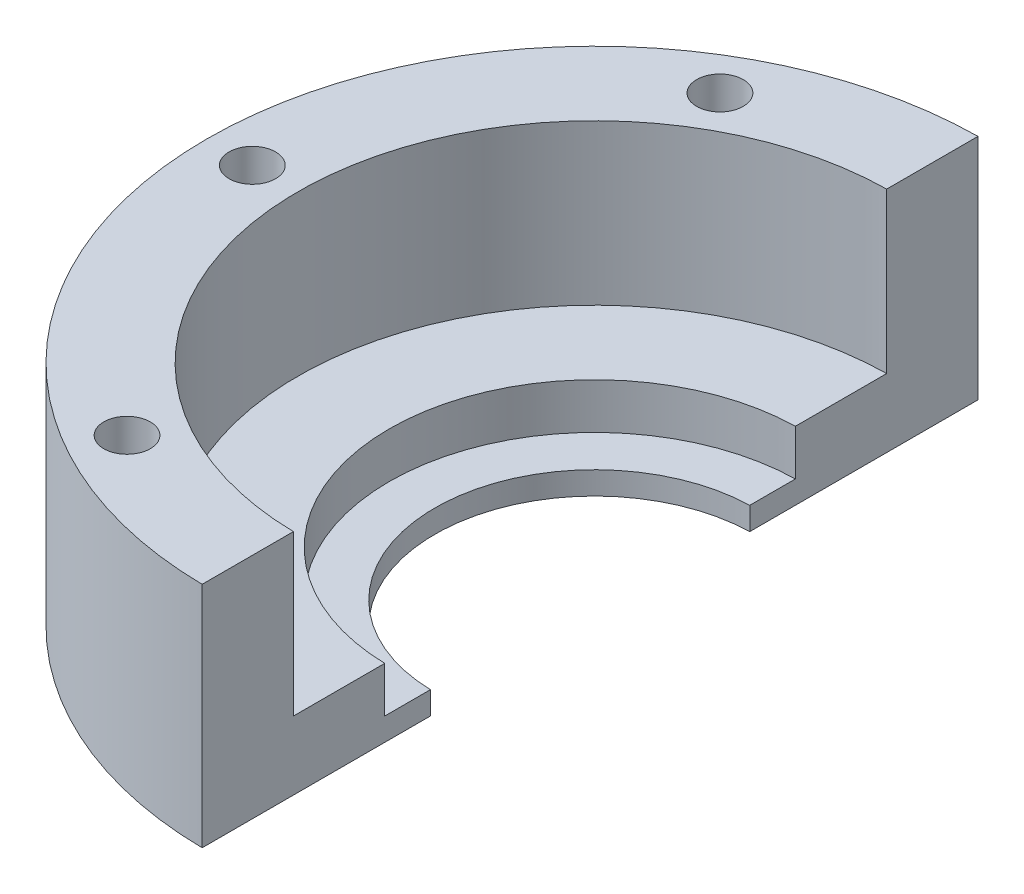
ISO-10303-21;
HEADER;
FILE_DESCRIPTION(('STEP AP214'),'2;1');
FILE_NAME('part.step','',(''),(''),'','','');
FILE_SCHEMA(('AUTOMOTIVE_DESIGN { 1 0 10303 214 1 1 1 1 }'));
ENDSEC;
DATA;
#1=APPLICATION_CONTEXT('core data for automotive mechanical design processes');
#2=APPLICATION_PROTOCOL_DEFINITION('international standard','automotive_design',2000,#1);
#3=PRODUCT_CONTEXT('',#1,'mechanical');
#4=PRODUCT('Part','Part','',(#3));
#5=PRODUCT_RELATED_PRODUCT_CATEGORY('part','',(#4));
#6=PRODUCT_DEFINITION_FORMATION('','',#4);
#7=PRODUCT_DEFINITION_CONTEXT('part definition',#1,'design');
#8=PRODUCT_DEFINITION('design','',#6,#7);
#9=PRODUCT_DEFINITION_SHAPE('','',#8);
#10=(LENGTH_UNIT() NAMED_UNIT(*) SI_UNIT(.MILLI.,.METRE.));
#11=(NAMED_UNIT(*) PLANE_ANGLE_UNIT() SI_UNIT($,.RADIAN.));
#12=(NAMED_UNIT(*) SI_UNIT($,.STERADIAN.) SOLID_ANGLE_UNIT());
#13=UNCERTAINTY_MEASURE_WITH_UNIT(LENGTH_MEASURE(1.E-05),#10,'distance_accuracy_value','');
#14=(GEOMETRIC_REPRESENTATION_CONTEXT(3) GLOBAL_UNCERTAINTY_ASSIGNED_CONTEXT((#13)) GLOBAL_UNIT_ASSIGNED_CONTEXT((#10,
#11,#12)) REPRESENTATION_CONTEXT('',''));
#15=CARTESIAN_POINT('',(0.,0.,0.));
#16=DIRECTION('',(0.,0.,1.));
#17=DIRECTION('',(1.,0.,0.));
#18=AXIS2_PLACEMENT_3D('',#15,#16,#17);
#19=CARTESIAN_POINT('',(-75.,0.,0.));
#20=DIRECTION('',(0.,-1.,0.));
#21=DIRECTION('',(0.,0.,-1.));
#22=AXIS2_PLACEMENT_3D('',#19,#20,#21);
#23=CYLINDRICAL_SURFACE('',#22,5.1);
#24=CARTESIAN_POINT('',(-75.,50.,0.));
#25=DIRECTION('',(0.,-1.,0.));
#26=DIRECTION('',(0.,0.,-1.));
#27=AXIS2_PLACEMENT_3D('',#24,#25,#26);
#28=CIRCLE('',#27,5.1);
#29=CARTESIAN_POINT('',(-75.,50.,-5.1));
#30=VERTEX_POINT('',#29);
#31=EDGE_CURVE('E131',#30,#30,#28,.T.);
#32=ORIENTED_EDGE('',*,*,#31,.F.);
#33=EDGE_LOOP('',(#32));
#34=FACE_BOUND('',#33,.T.);
#35=CARTESIAN_POINT('',(-75.,0.,0.));
#36=DIRECTION('',(0.,-1.,0.));
#37=DIRECTION('',(0.,0.,-1.));
#38=AXIS2_PLACEMENT_3D('',#35,#36,#37);
#39=CIRCLE('',#38,5.1);
#40=CARTESIAN_POINT('',(-75.,0.,-5.1));
#41=VERTEX_POINT('',#40);
#42=EDGE_CURVE('E121',#41,#41,#39,.T.);
#43=ORIENTED_EDGE('',*,*,#42,.T.);
#44=EDGE_LOOP('',(#43));
#45=FACE_BOUND('',#44,.T.);
#46=ADVANCED_FACE('F16',(#34,#45),#23,.F.);
#47=CARTESIAN_POINT('',(-37.5,0.,-64.951905283833));
#48=DIRECTION('',(0.,-1.,0.));
#49=DIRECTION('',(0.,0.,-1.));
#50=AXIS2_PLACEMENT_3D('',#47,#48,#49);
#51=CYLINDRICAL_SURFACE('',#50,5.1);
#52=CARTESIAN_POINT('',(-37.5,50.,-64.951905283833));
#53=DIRECTION('',(0.,-1.,0.));
#54=DIRECTION('',(0.,0.,-1.));
#55=AXIS2_PLACEMENT_3D('',#52,#53,#54);
#56=CIRCLE('',#55,5.1);
#57=CARTESIAN_POINT('',(-37.5,50.,-70.051905283833));
#58=VERTEX_POINT('',#57);
#59=EDGE_CURVE('E134',#58,#58,#56,.T.);
#60=ORIENTED_EDGE('',*,*,#59,.F.);
#61=EDGE_LOOP('',(#60));
#62=FACE_BOUND('',#61,.T.);
#63=CARTESIAN_POINT('',(-37.5,0.,-64.951905283833));
#64=DIRECTION('',(0.,-1.,0.));
#65=DIRECTION('',(0.,0.,-1.));
#66=AXIS2_PLACEMENT_3D('',#63,#64,#65);
#67=CIRCLE('',#66,5.1);
#68=CARTESIAN_POINT('',(-37.5,0.,-70.051905283833));
#69=VERTEX_POINT('',#68);
#70=EDGE_CURVE('E118',#69,#69,#67,.T.);
#71=ORIENTED_EDGE('',*,*,#70,.T.);
#72=EDGE_LOOP('',(#71));
#73=FACE_BOUND('',#72,.T.);
#74=ADVANCED_FACE('F274',(#62,#73),#51,.F.);
#75=CARTESIAN_POINT('',(-37.5000000000007,0.,64.9519052838325));
#76=DIRECTION('',(0.,-1.,0.));
#77=DIRECTION('',(0.,0.,-1.));
#78=AXIS2_PLACEMENT_3D('',#75,#76,#77);
#79=CYLINDRICAL_SURFACE('',#78,5.1);
#80=CARTESIAN_POINT('',(-37.5000000000007,50.,64.9519052838325));
#81=DIRECTION('',(0.,-1.,0.));
#82=DIRECTION('',(0.,0.,-1.));
#83=AXIS2_PLACEMENT_3D('',#80,#81,#82);
#84=CIRCLE('',#83,5.1);
#85=CARTESIAN_POINT('',(-37.5000000000007,50.,59.8519052838325));
#86=VERTEX_POINT('',#85);
#87=EDGE_CURVE('E128',#86,#86,#84,.T.);
#88=ORIENTED_EDGE('',*,*,#87,.F.);
#89=EDGE_LOOP('',(#88));
#90=FACE_BOUND('',#89,.T.);
#91=CARTESIAN_POINT('',(-37.5000000000007,0.,64.9519052838325));
#92=DIRECTION('',(0.,-1.,0.));
#93=DIRECTION('',(0.,0.,-1.));
#94=AXIS2_PLACEMENT_3D('',#91,#92,#93);
#95=CIRCLE('',#94,5.1);
#96=CARTESIAN_POINT('',(-37.5000000000007,0.,59.8519052838325));
#97=VERTEX_POINT('',#96);
#98=EDGE_CURVE('E115',#97,#97,#95,.T.);
#99=ORIENTED_EDGE('',*,*,#98,.T.);
#100=EDGE_LOOP('',(#99));
#101=FACE_BOUND('',#100,.T.);
#102=ADVANCED_FACE('F265',(#90,#101),#79,.F.);
#103=CARTESIAN_POINT('',(0.,50.,0.));
#104=DIRECTION('',(0.,-1.,0.));
#105=DIRECTION('',(0.,0.,-1.));
#106=AXIS2_PLACEMENT_3D('',#103,#104,#105);
#107=CYLINDRICAL_SURFACE('',#106,45.);
#108=CARTESIAN_POINT('',(0.,15.,0.));
#109=DIRECTION('',(0.,-1.,0.));
#110=DIRECTION('',(0.,0.,-1.));
#111=AXIS2_PLACEMENT_3D('',#108,#109,#110);
#112=CIRCLE('',#111,45.);
#113=CARTESIAN_POINT('',(-1.,15.,44.9888875168079));
#114=VERTEX_POINT('',#113);
#115=CARTESIAN_POINT('',(-1.,15.,-44.9888875168079));
#116=VERTEX_POINT('',#115);
#117=EDGE_CURVE('E143',#114,#116,#112,.T.);
#118=ORIENTED_EDGE('',*,*,#117,.F.);
#119=DIRECTION('',(0.,1.,0.));
#120=VECTOR('',#119,1.);
#121=CARTESIAN_POINT('',(-1.,-365.285165408627,44.9888875168079));
#122=LINE('',#121,#120);
#123=CARTESIAN_POINT('',(-1.,5.,44.9888875168079));
#124=VERTEX_POINT('',#123);
#125=EDGE_CURVE('E85',#114,#124,#122,.F.);
#126=ORIENTED_EDGE('',*,*,#125,.T.);
#127=CARTESIAN_POINT('',(0.,5.,0.));
#128=DIRECTION('',(0.,-1.,0.));
#129=DIRECTION('',(0.,0.,-1.));
#130=AXIS2_PLACEMENT_3D('',#127,#128,#129);
#131=CIRCLE('',#130,45.);
#132=CARTESIAN_POINT('',(-1.,5.,-44.9888875168079));
#133=VERTEX_POINT('',#132);
#134=EDGE_CURVE('E19',#133,#124,#131,.F.);
#135=ORIENTED_EDGE('',*,*,#134,.F.);
#136=DIRECTION('',(0.,1.,0.));
#137=VECTOR('',#136,1.);
#138=CARTESIAN_POINT('',(-1.,-365.285165408627,-44.9888875168079));
#139=LINE('',#138,#137);
#140=EDGE_CURVE('E82',#133,#116,#139,.T.);
#141=ORIENTED_EDGE('',*,*,#140,.T.);
#142=EDGE_LOOP('',(#118,#126,#135,#141));
#143=FACE_BOUND('',#142,.T.);
#144=ADVANCED_FACE('F80',(#143),#107,.F.);
#145=CARTESIAN_POINT('',(0.,5.,0.));
#146=DIRECTION('',(0.,1.,0.));
#147=DIRECTION('',(0.,0.,1.));
#148=AXIS2_PLACEMENT_3D('',#145,#146,#147);
#149=PLANE('',#148);
#150=DIRECTION('',(0.,0.,1.));
#151=VECTOR('',#150,1.);
#152=CARTESIAN_POINT('',(-1.,5.,-100.));
#153=LINE('',#152,#151);
#154=CARTESIAN_POINT('',(-1.,5.,34.9857113690718));
#155=VERTEX_POINT('',#154);
#156=EDGE_CURVE('E154',#124,#155,#153,.F.);
#157=ORIENTED_EDGE('',*,*,#156,.T.);
#158=CARTESIAN_POINT('',(0.,5.,0.));
#159=DIRECTION('',(0.,-1.,0.));
#160=DIRECTION('',(0.,0.,-1.));
#161=AXIS2_PLACEMENT_3D('',#158,#159,#160);
#162=CIRCLE('',#161,35.);
#163=CARTESIAN_POINT('',(-1.,5.,-34.9857113690718));
#164=VERTEX_POINT('',#163);
#165=EDGE_CURVE('E88',#155,#164,#162,.T.);
#166=ORIENTED_EDGE('',*,*,#165,.T.);
#167=DIRECTION('',(0.,0.,1.));
#168=VECTOR('',#167,1.);
#169=CARTESIAN_POINT('',(-1.,5.,-100.));
#170=LINE('',#169,#168);
#171=EDGE_CURVE('E90',#164,#133,#170,.F.);
#172=ORIENTED_EDGE('',*,*,#171,.T.);
#173=ORIENTED_EDGE('',*,*,#134,.T.);
#174=EDGE_LOOP('',(#157,#166,#172,#173));
#175=FACE_BOUND('',#174,.T.);
#176=ADVANCED_FACE('F91',(#175),#149,.T.);
#177=CARTESIAN_POINT('',(0.,5.,0.));
#178=DIRECTION('',(0.,-1.,0.));
#179=DIRECTION('',(0.,0.,-1.));
#180=AXIS2_PLACEMENT_3D('',#177,#178,#179);
#181=CYLINDRICAL_SURFACE('',#180,35.);
#182=ORIENTED_EDGE('',*,*,#165,.F.);
#183=DIRECTION('',(0.,1.,0.));
#184=VECTOR('',#183,1.);
#185=CARTESIAN_POINT('',(-1.,-365.285165408627,34.9857113690719));
#186=LINE('',#185,#184);
#187=CARTESIAN_POINT('',(-1.,0.,34.9857113690718));
#188=VERTEX_POINT('',#187);
#189=EDGE_CURVE('E156',#155,#188,#186,.F.);
#190=ORIENTED_EDGE('',*,*,#189,.T.);
#191=CARTESIAN_POINT('',(0.,0.,0.));
#192=DIRECTION('',(0.,-1.,0.));
#193=DIRECTION('',(0.,0.,-1.));
#194=AXIS2_PLACEMENT_3D('',#191,#192,#193);
#195=CIRCLE('',#194,35.);
#196=CARTESIAN_POINT('',(-1.,0.,-34.9857113690718));
#197=VERTEX_POINT('',#196);
#198=EDGE_CURVE('E125',#188,#197,#195,.T.);
#199=ORIENTED_EDGE('',*,*,#198,.T.);
#200=DIRECTION('',(0.,1.,0.));
#201=VECTOR('',#200,1.);
#202=CARTESIAN_POINT('',(-1.,-365.285165408627,-34.9857113690718));
#203=LINE('',#202,#201);
#204=EDGE_CURVE('E96',#197,#164,#203,.T.);
#205=ORIENTED_EDGE('',*,*,#204,.T.);
#206=EDGE_LOOP('',(#182,#190,#199,#205));
#207=FACE_BOUND('',#206,.T.);
#208=ADVANCED_FACE('F180',(#207),#181,.F.);
#209=CARTESIAN_POINT('',(0.,15.,0.));
#210=DIRECTION('',(0.,1.,0.));
#211=DIRECTION('',(0.,0.,1.));
#212=AXIS2_PLACEMENT_3D('',#209,#210,#211);
#213=CYLINDRICAL_SURFACE('',#212,65.);
#214=DIRECTION('',(0.,1.,0.));
#215=VECTOR('',#214,1.);
#216=CARTESIAN_POINT('',(-1.,-365.285165408627,-64.9923072370877));
#217=LINE('',#216,#215);
#218=CARTESIAN_POINT('',(-1.,15.,-64.9923072370877));
#219=VERTEX_POINT('',#218);
#220=CARTESIAN_POINT('',(-1.,50.,-64.9923072370877));
#221=VERTEX_POINT('',#220);
#222=EDGE_CURVE('E104',#219,#221,#217,.T.);
#223=ORIENTED_EDGE('',*,*,#222,.T.);
#224=CARTESIAN_POINT('',(0.,50.,0.));
#225=DIRECTION('',(0.,1.,0.));
#226=DIRECTION('',(0.,0.,1.));
#227=AXIS2_PLACEMENT_3D('',#224,#225,#226);
#228=CIRCLE('',#227,65.);
#229=CARTESIAN_POINT('',(-1.,50.,64.9923072370877));
#230=VERTEX_POINT('',#229);
#231=EDGE_CURVE('E137',#230,#221,#228,.F.);
#232=ORIENTED_EDGE('',*,*,#231,.F.);
#233=DIRECTION('',(0.,1.,0.));
#234=VECTOR('',#233,1.);
#235=CARTESIAN_POINT('',(-1.,-365.285165408627,64.9923072370877));
#236=LINE('',#235,#234);
#237=CARTESIAN_POINT('',(-1.,15.,64.9923072370877));
#238=VERTEX_POINT('',#237);
#239=EDGE_CURVE('E150',#230,#238,#236,.F.);
#240=ORIENTED_EDGE('',*,*,#239,.T.);
#241=CARTESIAN_POINT('',(0.,15.,0.));
#242=DIRECTION('',(0.,1.,0.));
#243=DIRECTION('',(0.,0.,1.));
#244=AXIS2_PLACEMENT_3D('',#241,#242,#243);
#245=CIRCLE('',#244,65.);
#246=EDGE_CURVE('E140',#219,#238,#245,.T.);
#247=ORIENTED_EDGE('',*,*,#246,.F.);
#248=EDGE_LOOP('',(#223,#232,#240,#247));
#249=FACE_BOUND('',#248,.T.);
#250=ADVANCED_FACE('F170',(#249),#213,.F.);
#251=CARTESIAN_POINT('',(0.,15.,0.));
#252=DIRECTION('',(0.,1.,0.));
#253=DIRECTION('',(0.,0.,1.));
#254=AXIS2_PLACEMENT_3D('',#251,#252,#253);
#255=PLANE('',#254);
#256=DIRECTION('',(0.,0.,1.));
#257=VECTOR('',#256,1.);
#258=CARTESIAN_POINT('',(-1.,15.,-100.));
#259=LINE('',#258,#257);
#260=EDGE_CURVE('E102',#116,#219,#259,.F.);
#261=ORIENTED_EDGE('',*,*,#260,.T.);
#262=ORIENTED_EDGE('',*,*,#246,.T.);
#263=DIRECTION('',(0.,0.,1.));
#264=VECTOR('',#263,1.);
#265=CARTESIAN_POINT('',(-1.,15.,-100.));
#266=LINE('',#265,#264);
#267=EDGE_CURVE('E114',#238,#114,#266,.F.);
#268=ORIENTED_EDGE('',*,*,#267,.T.);
#269=ORIENTED_EDGE('',*,*,#117,.T.);
#270=EDGE_LOOP('',(#261,#262,#268,#269));
#271=FACE_BOUND('',#270,.T.);
#272=ADVANCED_FACE('F146',(#271),#255,.T.);
#273=CARTESIAN_POINT('',(0.,50.,0.));
#274=DIRECTION('',(0.,1.,0.));
#275=DIRECTION('',(0.,0.,1.));
#276=AXIS2_PLACEMENT_3D('',#273,#274,#275);
#277=PLANE('',#276);
#278=ORIENTED_EDGE('',*,*,#87,.T.);
#279=EDGE_LOOP('',(#278));
#280=FACE_BOUND('',#279,.T.);
#281=ORIENTED_EDGE('',*,*,#31,.T.);
#282=EDGE_LOOP('',(#281));
#283=FACE_BOUND('',#282,.T.);
#284=ORIENTED_EDGE('',*,*,#59,.T.);
#285=EDGE_LOOP('',(#284));
#286=FACE_BOUND('',#285,.T.);
#287=CARTESIAN_POINT('',(0.,50.,0.));
#288=DIRECTION('',(0.,-1.,0.));
#289=DIRECTION('',(0.,0.,-1.));
#290=AXIS2_PLACEMENT_3D('',#287,#288,#289);
#291=CIRCLE('',#290,85.);
#292=CARTESIAN_POINT('',(-0.99999999999998,50.,84.9941174435031));
#293=VERTEX_POINT('',#292);
#294=CARTESIAN_POINT('',(-1.00000000000001,50.,-84.9941174435031));
#295=VERTEX_POINT('',#294);
#296=EDGE_CURVE('E111',#293,#295,#291,.T.);
#297=ORIENTED_EDGE('',*,*,#296,.F.);
#298=DIRECTION('',(0.,0.,1.));
#299=VECTOR('',#298,1.);
#300=CARTESIAN_POINT('',(-1.,50.,-100.));
#301=LINE('',#300,#299);
#302=EDGE_CURVE('E168',#293,#230,#301,.F.);
#303=ORIENTED_EDGE('',*,*,#302,.T.);
#304=ORIENTED_EDGE('',*,*,#231,.T.);
#305=DIRECTION('',(0.,0.,1.));
#306=VECTOR('',#305,1.);
#307=CARTESIAN_POINT('',(-1.,50.,-100.));
#308=LINE('',#307,#306);
#309=EDGE_CURVE('E127',#221,#295,#308,.F.);
#310=ORIENTED_EDGE('',*,*,#309,.T.);
#311=EDGE_LOOP('',(#297,#303,#304,#310));
#312=FACE_BOUND('',#311,.T.);
#313=ADVANCED_FACE('F204',(#280,#283,#286,#312),#277,.T.);
#314=CARTESIAN_POINT('',(-1.,-365.285165408627,-100.));
#315=DIRECTION('',(-1.,0.,0.));
#316=DIRECTION('',(0.,0.,1.));
#317=AXIS2_PLACEMENT_3D('',#314,#315,#316);
#318=PLANE('',#317);
#319=ORIENTED_EDGE('',*,*,#222,.F.);
#320=ORIENTED_EDGE('',*,*,#260,.F.);
#321=ORIENTED_EDGE('',*,*,#140,.F.);
#322=ORIENTED_EDGE('',*,*,#171,.F.);
#323=ORIENTED_EDGE('',*,*,#204,.F.);
#324=DIRECTION('',(0.,0.,1.));
#325=VECTOR('',#324,1.);
#326=CARTESIAN_POINT('',(-1.,0.,0.));
#327=LINE('',#326,#325);
#328=CARTESIAN_POINT('',(-1.00000000000001,0.,-84.9941174435031));
#329=VERTEX_POINT('',#328);
#330=EDGE_CURVE('E124',#197,#329,#327,.F.);
#331=ORIENTED_EDGE('',*,*,#330,.T.);
#332=DIRECTION('',(0.,-1.,0.));
#333=VECTOR('',#332,1.);
#334=CARTESIAN_POINT('',(-1.00000000000003,5.,-84.9941174435031));
#335=LINE('',#334,#333);
#336=EDGE_CURVE('E110',#295,#329,#335,.T.);
#337=ORIENTED_EDGE('',*,*,#336,.F.);
#338=ORIENTED_EDGE('',*,*,#309,.F.);
#339=EDGE_LOOP('',(#319,#320,#321,#322,#323,#331,#337,#338));
#340=FACE_BOUND('',#339,.T.);
#341=ADVANCED_FACE('F100',(#340),#318,.F.);
#342=CARTESIAN_POINT('',(0.,0.,0.));
#343=DIRECTION('',(0.,1.,0.));
#344=DIRECTION('',(0.,0.,1.));
#345=AXIS2_PLACEMENT_3D('',#342,#343,#344);
#346=PLANE('',#345);
#347=ORIENTED_EDGE('',*,*,#98,.F.);
#348=EDGE_LOOP('',(#347));
#349=FACE_BOUND('',#348,.T.);
#350=ORIENTED_EDGE('',*,*,#70,.F.);
#351=EDGE_LOOP('',(#350));
#352=FACE_BOUND('',#351,.T.);
#353=ORIENTED_EDGE('',*,*,#42,.F.);
#354=EDGE_LOOP('',(#353));
#355=FACE_BOUND('',#354,.T.);
#356=ORIENTED_EDGE('',*,*,#330,.F.);
#357=ORIENTED_EDGE('',*,*,#198,.F.);
#358=DIRECTION('',(0.,0.,1.));
#359=VECTOR('',#358,1.);
#360=CARTESIAN_POINT('',(-1.,0.,-100.));
#361=LINE('',#360,#359);
#362=CARTESIAN_POINT('',(-0.99999999999998,0.,84.9941174435031));
#363=VERTEX_POINT('',#362);
#364=EDGE_CURVE('E34',#188,#363,#361,.T.);
#365=ORIENTED_EDGE('',*,*,#364,.T.);
#366=CARTESIAN_POINT('',(0.,0.,0.));
#367=DIRECTION('',(0.,-1.,0.));
#368=DIRECTION('',(0.,0.,-1.));
#369=AXIS2_PLACEMENT_3D('',#366,#367,#368);
#370=CIRCLE('',#369,85.);
#371=EDGE_CURVE('E25',#329,#363,#370,.F.);
#372=ORIENTED_EDGE('',*,*,#371,.F.);
#373=EDGE_LOOP('',(#356,#357,#365,#372));
#374=FACE_BOUND('',#373,.T.);
#375=ADVANCED_FACE('F176',(#349,#352,#355,#374),#346,.F.);
#376=CARTESIAN_POINT('',(-1.,-365.285165408627,-100.));
#377=DIRECTION('',(-1.,0.,0.));
#378=DIRECTION('',(0.,0.,1.));
#379=AXIS2_PLACEMENT_3D('',#376,#377,#378);
#380=PLANE('',#379);
#381=ORIENTED_EDGE('',*,*,#239,.F.);
#382=ORIENTED_EDGE('',*,*,#302,.F.);
#383=DIRECTION('',(0.,-1.,0.));
#384=VECTOR('',#383,1.);
#385=CARTESIAN_POINT('',(-0.999999999999961,5.,84.9941174435031));
#386=LINE('',#385,#384);
#387=EDGE_CURVE('E11',#363,#293,#386,.F.);
#388=ORIENTED_EDGE('',*,*,#387,.F.);
#389=ORIENTED_EDGE('',*,*,#364,.F.);
#390=ORIENTED_EDGE('',*,*,#189,.F.);
#391=ORIENTED_EDGE('',*,*,#156,.F.);
#392=ORIENTED_EDGE('',*,*,#125,.F.);
#393=ORIENTED_EDGE('',*,*,#267,.F.);
#394=EDGE_LOOP('',(#381,#382,#388,#389,#390,#391,#392,#393));
#395=FACE_BOUND('',#394,.T.);
#396=ADVANCED_FACE('F152',(#395),#380,.F.);
#397=CARTESIAN_POINT('',(0.,5.,0.));
#398=DIRECTION('',(0.,-1.,0.));
#399=DIRECTION('',(0.,0.,-1.));
#400=AXIS2_PLACEMENT_3D('',#397,#398,#399);
#401=CYLINDRICAL_SURFACE('',#400,85.);
#402=ORIENTED_EDGE('',*,*,#371,.T.);
#403=ORIENTED_EDGE('',*,*,#387,.T.);
#404=ORIENTED_EDGE('',*,*,#296,.T.);
#405=ORIENTED_EDGE('',*,*,#336,.T.);
#406=EDGE_LOOP('',(#402,#403,#404,#405));
#407=FACE_BOUND('',#406,.T.);
#408=ADVANCED_FACE('F173',(#407),#401,.T.);
#409=CLOSED_SHELL('',(#46,#74,#102,#144,#176,#208,#250,#272,#313,#341,#375,#396,#408));
#410=MANIFOLD_SOLID_BREP('B1',#409);
#411=ADVANCED_BREP_SHAPE_REPRESENTATION('',(#18,#410),#14);
#412=SHAPE_DEFINITION_REPRESENTATION(#9,#411);
ENDSEC;
END-ISO-10303-21;
